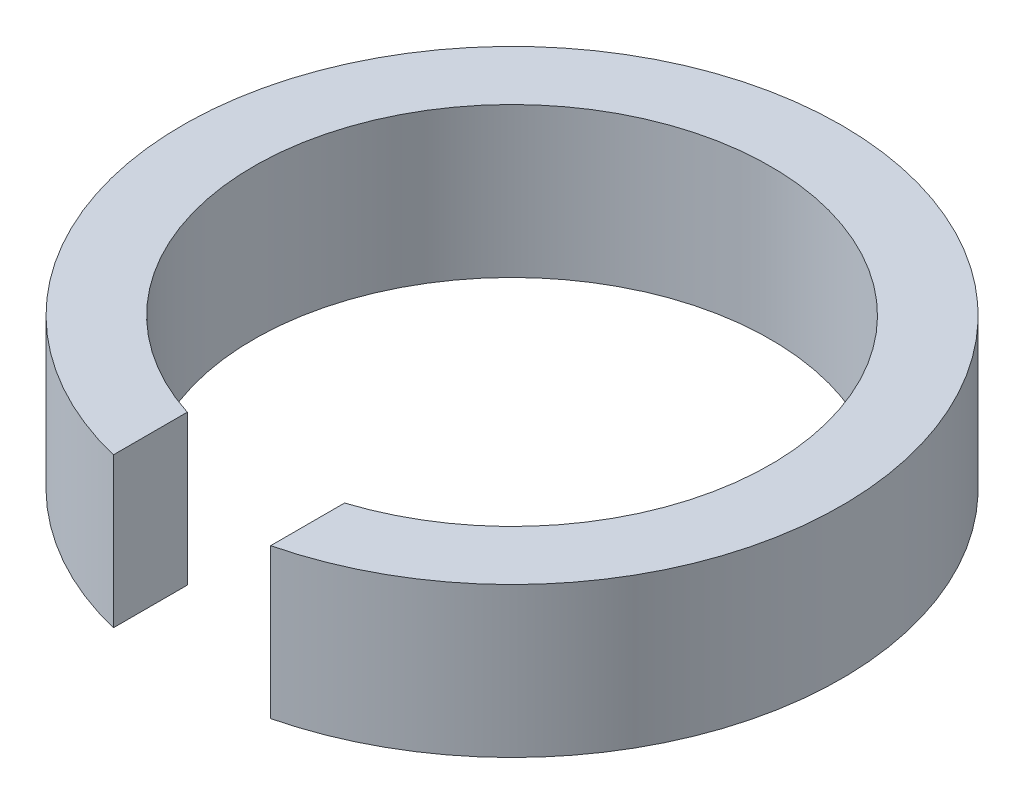
ISO-10303-21;
HEADER;
FILE_DESCRIPTION(('STEP AP214'),'2;1');
FILE_NAME('part.step','',(''),(''),'','','');
FILE_SCHEMA(('AUTOMOTIVE_DESIGN { 1 0 10303 214 1 1 1 1 }'));
ENDSEC;
DATA;
#1=APPLICATION_CONTEXT('core data for automotive mechanical design processes');
#2=APPLICATION_PROTOCOL_DEFINITION('international standard','automotive_design',2000,#1);
#3=PRODUCT_CONTEXT('',#1,'mechanical');
#4=PRODUCT('Part','Part','',(#3));
#5=PRODUCT_RELATED_PRODUCT_CATEGORY('part','',(#4));
#6=PRODUCT_DEFINITION_FORMATION('','',#4);
#7=PRODUCT_DEFINITION_CONTEXT('part definition',#1,'design');
#8=PRODUCT_DEFINITION('design','',#6,#7);
#9=PRODUCT_DEFINITION_SHAPE('','',#8);
#10=(LENGTH_UNIT() NAMED_UNIT(*) SI_UNIT(.MILLI.,.METRE.));
#11=(NAMED_UNIT(*) PLANE_ANGLE_UNIT() SI_UNIT($,.RADIAN.));
#12=(NAMED_UNIT(*) SI_UNIT($,.STERADIAN.) SOLID_ANGLE_UNIT());
#13=UNCERTAINTY_MEASURE_WITH_UNIT(LENGTH_MEASURE(1.E-05),#10,'distance_accuracy_value','');
#14=(GEOMETRIC_REPRESENTATION_CONTEXT(3) GLOBAL_UNCERTAINTY_ASSIGNED_CONTEXT((#13)) GLOBAL_UNIT_ASSIGNED_CONTEXT((#10,
#11,#12)) REPRESENTATION_CONTEXT('',''));
#15=CARTESIAN_POINT('',(0.,0.,0.));
#16=DIRECTION('',(0.,0.,1.));
#17=DIRECTION('',(1.,0.,0.));
#18=AXIS2_PLACEMENT_3D('',#15,#16,#17);
#19=CARTESIAN_POINT('',(1.05,2.,0.));
#20=DIRECTION('',(1.,0.,0.));
#21=DIRECTION('',(0.,0.,-1.));
#22=AXIS2_PLACEMENT_3D('',#19,#20,#21);
#23=PLANE('',#22);
#24=DIRECTION('',(0.,0.,1.));
#25=VECTOR('',#24,1.);
#26=CARTESIAN_POINT('',(1.05,0.,0.));
#27=LINE('',#26,#25);
#28=CARTESIAN_POINT('',(1.05,0.,3.286335345031));
#29=VERTEX_POINT('',#28);
#30=CARTESIAN_POINT('',(1.05,0.,4.27287959109545));
#31=VERTEX_POINT('',#30);
#32=EDGE_CURVE('E98',#29,#31,#27,.T.);
#33=ORIENTED_EDGE('',*,*,#32,.T.);
#34=DIRECTION('',(0.,-1.,0.));
#35=VECTOR('',#34,1.);
#36=CARTESIAN_POINT('',(1.05,2.,4.27287959109545));
#37=LINE('',#36,#35);
#38=CARTESIAN_POINT('',(1.05,2.,4.27287959109545));
#39=VERTEX_POINT('',#38);
#40=EDGE_CURVE('E11',#39,#31,#37,.T.);
#41=ORIENTED_EDGE('',*,*,#40,.F.);
#42=DIRECTION('',(0.,0.,1.));
#43=VECTOR('',#42,1.);
#44=CARTESIAN_POINT('',(1.05,2.,0.));
#45=LINE('',#44,#43);
#46=CARTESIAN_POINT('',(1.05,2.,3.286335345031));
#47=VERTEX_POINT('',#46);
#48=EDGE_CURVE('E84',#47,#39,#45,.T.);
#49=ORIENTED_EDGE('',*,*,#48,.F.);
#50=DIRECTION('',(0.,-1.,0.));
#51=VECTOR('',#50,1.);
#52=CARTESIAN_POINT('',(1.05,2.,3.286335345031));
#53=LINE('',#52,#51);
#54=EDGE_CURVE('E51',#47,#29,#53,.T.);
#55=ORIENTED_EDGE('',*,*,#54,.T.);
#56=EDGE_LOOP('',(#33,#41,#49,#55));
#57=FACE_BOUND('',#56,.T.);
#58=ADVANCED_FACE('F35',(#57),#23,.F.);
#59=CARTESIAN_POINT('',(0.,2.,0.));
#60=DIRECTION('',(0.,-1.,0.));
#61=DIRECTION('',(0.,0.,-1.));
#62=AXIS2_PLACEMENT_3D('',#59,#60,#61);
#63=CYLINDRICAL_SURFACE('',#62,4.4);
#64=CARTESIAN_POINT('',(0.,0.,0.));
#65=DIRECTION('',(0.,1.,0.));
#66=DIRECTION('',(0.,0.,1.));
#67=AXIS2_PLACEMENT_3D('',#64,#65,#66);
#68=CIRCLE('',#67,4.4);
#69=CARTESIAN_POINT('',(-1.05,0.,4.27287959109545));
#70=VERTEX_POINT('',#69);
#71=EDGE_CURVE('E89',#31,#70,#68,.T.);
#72=ORIENTED_EDGE('',*,*,#71,.T.);
#73=DIRECTION('',(0.,-1.,0.));
#74=VECTOR('',#73,1.);
#75=CARTESIAN_POINT('',(-1.05,2.,4.27287959109545));
#76=LINE('',#75,#74);
#77=CARTESIAN_POINT('',(-1.05,2.,4.27287959109545));
#78=VERTEX_POINT('',#77);
#79=EDGE_CURVE('E43',#78,#70,#76,.T.);
#80=ORIENTED_EDGE('',*,*,#79,.F.);
#81=CARTESIAN_POINT('',(0.,2.,0.));
#82=DIRECTION('',(0.,1.,0.));
#83=DIRECTION('',(0.,0.,1.));
#84=AXIS2_PLACEMENT_3D('',#81,#82,#83);
#85=CIRCLE('',#84,4.4);
#86=EDGE_CURVE('E76',#39,#78,#85,.T.);
#87=ORIENTED_EDGE('',*,*,#86,.F.);
#88=ORIENTED_EDGE('',*,*,#40,.T.);
#89=EDGE_LOOP('',(#72,#80,#87,#88));
#90=FACE_BOUND('',#89,.T.);
#91=ADVANCED_FACE('F88',(#90),#63,.T.);
#92=CARTESIAN_POINT('',(-1.05,2.,0.));
#93=DIRECTION('',(1.,0.,0.));
#94=DIRECTION('',(0.,0.,-1.));
#95=AXIS2_PLACEMENT_3D('',#92,#93,#94);
#96=PLANE('',#95);
#97=DIRECTION('',(0.,0.,1.));
#98=VECTOR('',#97,1.);
#99=CARTESIAN_POINT('',(-1.05,0.,0.));
#100=LINE('',#99,#98);
#101=CARTESIAN_POINT('',(-1.05,0.,3.286335345031));
#102=VERTEX_POINT('',#101);
#103=EDGE_CURVE('E101',#102,#70,#100,.T.);
#104=ORIENTED_EDGE('',*,*,#103,.F.);
#105=DIRECTION('',(0.,-1.,0.));
#106=VECTOR('',#105,1.);
#107=CARTESIAN_POINT('',(-1.05,2.,3.286335345031));
#108=LINE('',#107,#106);
#109=CARTESIAN_POINT('',(-1.05,2.,3.286335345031));
#110=VERTEX_POINT('',#109);
#111=EDGE_CURVE('E65',#110,#102,#108,.T.);
#112=ORIENTED_EDGE('',*,*,#111,.F.);
#113=DIRECTION('',(0.,0.,1.));
#114=VECTOR('',#113,1.);
#115=CARTESIAN_POINT('',(-1.05,2.,0.));
#116=LINE('',#115,#114);
#117=EDGE_CURVE('E83',#110,#78,#116,.T.);
#118=ORIENTED_EDGE('',*,*,#117,.T.);
#119=ORIENTED_EDGE('',*,*,#79,.T.);
#120=EDGE_LOOP('',(#104,#112,#118,#119));
#121=FACE_BOUND('',#120,.T.);
#122=ADVANCED_FACE('F92',(#121),#96,.T.);
#123=CARTESIAN_POINT('',(0.,2.,0.));
#124=DIRECTION('',(0.,-1.,0.));
#125=DIRECTION('',(0.,0.,-1.));
#126=AXIS2_PLACEMENT_3D('',#123,#124,#125);
#127=CYLINDRICAL_SURFACE('',#126,3.45);
#128=CARTESIAN_POINT('',(0.,0.,0.));
#129=DIRECTION('',(0.,1.,0.));
#130=DIRECTION('',(0.,0.,1.));
#131=AXIS2_PLACEMENT_3D('',#128,#129,#130);
#132=CIRCLE('',#131,3.45);
#133=EDGE_CURVE('E103',#29,#102,#132,.T.);
#134=ORIENTED_EDGE('',*,*,#133,.F.);
#135=ORIENTED_EDGE('',*,*,#54,.F.);
#136=CARTESIAN_POINT('',(0.,2.,0.));
#137=DIRECTION('',(0.,1.,0.));
#138=DIRECTION('',(0.,0.,1.));
#139=AXIS2_PLACEMENT_3D('',#136,#137,#138);
#140=CIRCLE('',#139,3.45);
#141=EDGE_CURVE('E93',#47,#110,#140,.T.);
#142=ORIENTED_EDGE('',*,*,#141,.T.);
#143=ORIENTED_EDGE('',*,*,#111,.T.);
#144=EDGE_LOOP('',(#134,#135,#142,#143));
#145=FACE_BOUND('',#144,.T.);
#146=ADVANCED_FACE('F109',(#145),#127,.F.);
#147=CARTESIAN_POINT('',(0.,2.,0.));
#148=DIRECTION('',(0.,1.,0.));
#149=DIRECTION('',(0.,0.,1.));
#150=AXIS2_PLACEMENT_3D('',#147,#148,#149);
#151=PLANE('',#150);
#152=ORIENTED_EDGE('',*,*,#48,.T.);
#153=ORIENTED_EDGE('',*,*,#86,.T.);
#154=ORIENTED_EDGE('',*,*,#117,.F.);
#155=ORIENTED_EDGE('',*,*,#141,.F.);
#156=EDGE_LOOP('',(#152,#153,#154,#155));
#157=FACE_BOUND('',#156,.T.);
#158=ADVANCED_FACE('F80',(#157),#151,.T.);
#159=CARTESIAN_POINT('',(0.,0.,0.));
#160=DIRECTION('',(0.,1.,0.));
#161=DIRECTION('',(0.,0.,1.));
#162=AXIS2_PLACEMENT_3D('',#159,#160,#161);
#163=PLANE('',#162);
#164=ORIENTED_EDGE('',*,*,#32,.F.);
#165=ORIENTED_EDGE('',*,*,#133,.T.);
#166=ORIENTED_EDGE('',*,*,#103,.T.);
#167=ORIENTED_EDGE('',*,*,#71,.F.);
#168=EDGE_LOOP('',(#164,#165,#166,#167));
#169=FACE_BOUND('',#168,.T.);
#170=ADVANCED_FACE('F108',(#169),#163,.F.);
#171=CLOSED_SHELL('',(#58,#91,#122,#146,#158,#170));
#172=MANIFOLD_SOLID_BREP('B2',#171);
#173=ADVANCED_BREP_SHAPE_REPRESENTATION('',(#18,#172),#14);
#174=SHAPE_DEFINITION_REPRESENTATION(#9,#173);
ENDSEC;
END-ISO-10303-21;
